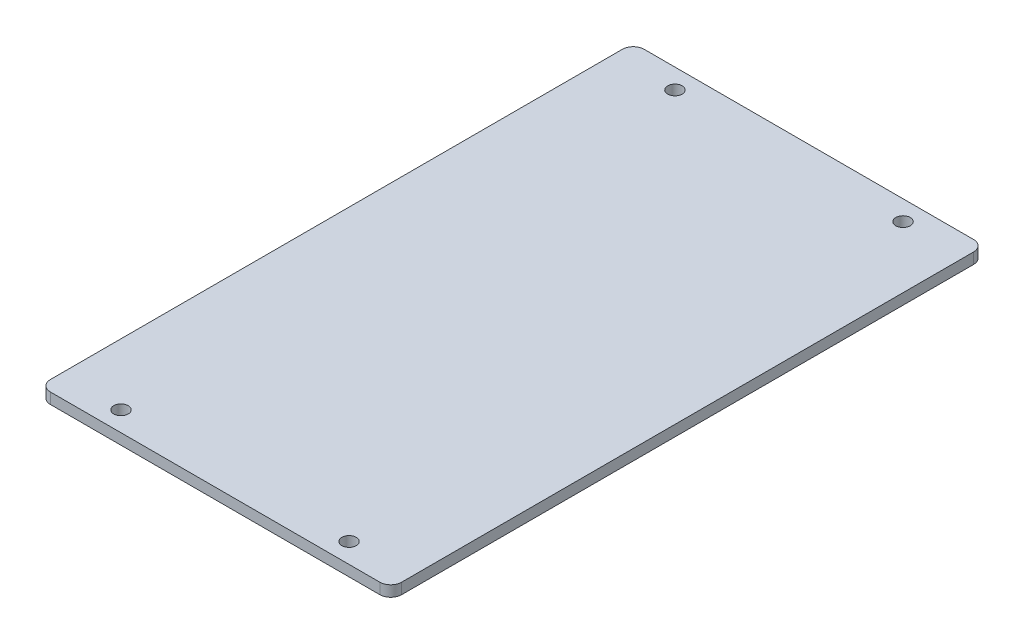
ISO-10303-21;
HEADER;
FILE_DESCRIPTION(('STEP AP214'),'2;1');
FILE_NAME('part.step','',(''),(''),'','','');
FILE_SCHEMA(('AUTOMOTIVE_DESIGN { 1 0 10303 214 1 1 1 1 }'));
ENDSEC;
DATA;
#1=APPLICATION_CONTEXT('core data for automotive mechanical design processes');
#2=APPLICATION_PROTOCOL_DEFINITION('international standard','automotive_design',2000,#1);
#3=PRODUCT_CONTEXT('',#1,'mechanical');
#4=PRODUCT('Part','Part','',(#3));
#5=PRODUCT_RELATED_PRODUCT_CATEGORY('part','',(#4));
#6=PRODUCT_DEFINITION_FORMATION('','',#4);
#7=PRODUCT_DEFINITION_CONTEXT('part definition',#1,'design');
#8=PRODUCT_DEFINITION('design','',#6,#7);
#9=PRODUCT_DEFINITION_SHAPE('','',#8);
#10=(LENGTH_UNIT() NAMED_UNIT(*) SI_UNIT(.MILLI.,.METRE.));
#11=(NAMED_UNIT(*) PLANE_ANGLE_UNIT() SI_UNIT($,.RADIAN.));
#12=(NAMED_UNIT(*) SI_UNIT($,.STERADIAN.) SOLID_ANGLE_UNIT());
#13=UNCERTAINTY_MEASURE_WITH_UNIT(LENGTH_MEASURE(1.E-05),#10,'distance_accuracy_value','');
#14=(GEOMETRIC_REPRESENTATION_CONTEXT(3) GLOBAL_UNCERTAINTY_ASSIGNED_CONTEXT((#13)) GLOBAL_UNIT_ASSIGNED_CONTEXT((#10,
#11,#12)) REPRESENTATION_CONTEXT('',''));
#15=CARTESIAN_POINT('',(0.,0.,0.));
#16=DIRECTION('',(0.,0.,1.));
#17=DIRECTION('',(1.,0.,0.));
#18=AXIS2_PLACEMENT_3D('',#15,#16,#17);
#19=CARTESIAN_POINT('',(-2.,3.,0.));
#20=DIRECTION('',(-1.,0.,0.));
#21=DIRECTION('',(0.,0.,1.));
#22=AXIS2_PLACEMENT_3D('',#19,#20,#21);
#23=PLANE('',#22);
#24=DIRECTION('',(0.,0.,-1.));
#25=VECTOR('',#24,1.);
#26=CARTESIAN_POINT('',(-2.,0.,0.));
#27=LINE('',#26,#25);
#28=CARTESIAN_POINT('',(-2.,0.,-1.));
#29=VERTEX_POINT('',#28);
#30=CARTESIAN_POINT('',(-2.,0.,-159.));
#31=VERTEX_POINT('',#30);
#32=EDGE_CURVE('E112',#29,#31,#27,.T.);
#33=ORIENTED_EDGE('',*,*,#32,.F.);
#34=DIRECTION('',(0.,-1.,0.));
#35=VECTOR('',#34,1.);
#36=CARTESIAN_POINT('',(-2.,3.,-1.));
#37=LINE('',#36,#35);
#38=CARTESIAN_POINT('',(-2.,3.,-1.));
#39=VERTEX_POINT('',#38);
#40=EDGE_CURVE('E11',#29,#39,#37,.F.);
#41=ORIENTED_EDGE('',*,*,#40,.T.);
#42=DIRECTION('',(0.,0.,-1.));
#43=VECTOR('',#42,1.);
#44=CARTESIAN_POINT('',(-2.,3.,0.));
#45=LINE('',#44,#43);
#46=CARTESIAN_POINT('',(-2.,3.,-159.));
#47=VERTEX_POINT('',#46);
#48=EDGE_CURVE('E178',#39,#47,#45,.T.);
#49=ORIENTED_EDGE('',*,*,#48,.T.);
#50=DIRECTION('',(0.,-1.,0.));
#51=VECTOR('',#50,1.);
#52=CARTESIAN_POINT('',(-2.,3.,-159.));
#53=LINE('',#52,#51);
#54=EDGE_CURVE('E49',#47,#31,#53,.T.);
#55=ORIENTED_EDGE('',*,*,#54,.T.);
#56=EDGE_LOOP('',(#33,#41,#49,#55));
#57=FACE_BOUND('',#56,.T.);
#58=ADVANCED_FACE('F40',(#57),#23,.T.);
#59=CARTESIAN_POINT('',(0.,3.,2.));
#60=DIRECTION('',(0.,0.,-1.));
#61=DIRECTION('',(-1.,0.,0.));
#62=AXIS2_PLACEMENT_3D('',#59,#60,#61);
#63=PLANE('',#62);
#64=DIRECTION('',(1.,0.,0.));
#65=VECTOR('',#64,1.);
#66=CARTESIAN_POINT('',(0.,0.,2.));
#67=LINE('',#66,#65);
#68=CARTESIAN_POINT('',(1.,0.,2.));
#69=VERTEX_POINT('',#68);
#70=CARTESIAN_POINT('',(92.,0.,2.));
#71=VERTEX_POINT('',#70);
#72=EDGE_CURVE('E212',#69,#71,#67,.T.);
#73=ORIENTED_EDGE('',*,*,#72,.T.);
#74=DIRECTION('',(0.,-1.,0.));
#75=VECTOR('',#74,1.);
#76=CARTESIAN_POINT('',(92.,3.,2.));
#77=LINE('',#76,#75);
#78=CARTESIAN_POINT('',(92.,3.,2.));
#79=VERTEX_POINT('',#78);
#80=EDGE_CURVE('E56',#71,#79,#77,.F.);
#81=ORIENTED_EDGE('',*,*,#80,.T.);
#82=DIRECTION('',(1.,0.,0.));
#83=VECTOR('',#82,1.);
#84=CARTESIAN_POINT('',(0.,3.,2.));
#85=LINE('',#84,#83);
#86=CARTESIAN_POINT('',(1.,3.,2.));
#87=VERTEX_POINT('',#86);
#88=EDGE_CURVE('E180',#87,#79,#85,.T.);
#89=ORIENTED_EDGE('',*,*,#88,.F.);
#90=DIRECTION('',(0.,-1.,0.));
#91=VECTOR('',#90,1.);
#92=CARTESIAN_POINT('',(1.,0.,2.));
#93=LINE('',#92,#91);
#94=EDGE_CURVE('E169',#87,#69,#93,.T.);
#95=ORIENTED_EDGE('',*,*,#94,.T.);
#96=EDGE_LOOP('',(#73,#81,#89,#95));
#97=FACE_BOUND('',#96,.T.);
#98=ADVANCED_FACE('F230',(#97),#63,.F.);
#99=CARTESIAN_POINT('',(95.,3.,0.));
#100=DIRECTION('',(-1.,0.,0.));
#101=DIRECTION('',(0.,0.,1.));
#102=AXIS2_PLACEMENT_3D('',#99,#100,#101);
#103=PLANE('',#102);
#104=DIRECTION('',(0.,0.,-1.));
#105=VECTOR('',#104,1.);
#106=CARTESIAN_POINT('',(95.,0.,0.));
#107=LINE('',#106,#105);
#108=CARTESIAN_POINT('',(95.,0.,-1.));
#109=VERTEX_POINT('',#108);
#110=CARTESIAN_POINT('',(95.,0.,-159.));
#111=VERTEX_POINT('',#110);
#112=EDGE_CURVE('E130',#109,#111,#107,.T.);
#113=ORIENTED_EDGE('',*,*,#112,.T.);
#114=DIRECTION('',(0.,-1.,0.));
#115=VECTOR('',#114,1.);
#116=CARTESIAN_POINT('',(95.,3.,-159.));
#117=LINE('',#116,#115);
#118=CARTESIAN_POINT('',(95.,3.,-159.));
#119=VERTEX_POINT('',#118);
#120=EDGE_CURVE('E156',#111,#119,#117,.F.);
#121=ORIENTED_EDGE('',*,*,#120,.T.);
#122=DIRECTION('',(0.,0.,-1.));
#123=VECTOR('',#122,1.);
#124=CARTESIAN_POINT('',(95.,3.,0.));
#125=LINE('',#124,#123);
#126=CARTESIAN_POINT('',(95.,3.,-1.));
#127=VERTEX_POINT('',#126);
#128=EDGE_CURVE('E140',#127,#119,#125,.T.);
#129=ORIENTED_EDGE('',*,*,#128,.F.);
#130=DIRECTION('',(0.,-1.,0.));
#131=VECTOR('',#130,1.);
#132=CARTESIAN_POINT('',(95.,3.,-1.));
#133=LINE('',#132,#131);
#134=EDGE_CURVE('E152',#127,#109,#133,.T.);
#135=ORIENTED_EDGE('',*,*,#134,.T.);
#136=EDGE_LOOP('',(#113,#121,#129,#135));
#137=FACE_BOUND('',#136,.T.);
#138=ADVANCED_FACE('F219',(#137),#103,.F.);
#139=CARTESIAN_POINT('',(15.,3.,-3.47847594984671));
#140=DIRECTION('',(0.,-1.,0.));
#141=DIRECTION('',(0.,0.,-1.));
#142=AXIS2_PLACEMENT_3D('',#139,#140,#141);
#143=CYLINDRICAL_SURFACE('',#142,2.);
#144=CARTESIAN_POINT('',(15.,3.,-3.47847594984671));
#145=DIRECTION('',(0.,1.,0.));
#146=DIRECTION('',(0.,0.,1.));
#147=AXIS2_PLACEMENT_3D('',#144,#145,#146);
#148=CIRCLE('',#147,2.);
#149=CARTESIAN_POINT('',(15.,3.,-1.47847594984671));
#150=VERTEX_POINT('',#149);
#151=EDGE_CURVE('E181',#150,#150,#148,.F.);
#152=ORIENTED_EDGE('',*,*,#151,.F.);
#153=EDGE_LOOP('',(#152));
#154=FACE_BOUND('',#153,.T.);
#155=CARTESIAN_POINT('',(15.,0.,-3.47847594984671));
#156=DIRECTION('',(0.,1.,0.));
#157=DIRECTION('',(0.,0.,1.));
#158=AXIS2_PLACEMENT_3D('',#155,#156,#157);
#159=CIRCLE('',#158,2.);
#160=CARTESIAN_POINT('',(15.,0.,-1.47847594984671));
#161=VERTEX_POINT('',#160);
#162=EDGE_CURVE('E206',#161,#161,#159,.F.);
#163=ORIENTED_EDGE('',*,*,#162,.T.);
#164=EDGE_LOOP('',(#163));
#165=FACE_BOUND('',#164,.T.);
#166=ADVANCED_FACE('F248',(#154,#165),#143,.F.);
#167=CARTESIAN_POINT('',(78.,3.,-3.47847594984671));
#168=DIRECTION('',(0.,-1.,0.));
#169=DIRECTION('',(0.,0.,-1.));
#170=AXIS2_PLACEMENT_3D('',#167,#168,#169);
#171=CYLINDRICAL_SURFACE('',#170,2.);
#172=CARTESIAN_POINT('',(78.,3.,-3.47847594984671));
#173=DIRECTION('',(0.,1.,0.));
#174=DIRECTION('',(0.,0.,1.));
#175=AXIS2_PLACEMENT_3D('',#172,#173,#174);
#176=CIRCLE('',#175,2.);
#177=CARTESIAN_POINT('',(78.,3.,-1.47847594984671));
#178=VERTEX_POINT('',#177);
#179=EDGE_CURVE('E187',#178,#178,#176,.T.);
#180=ORIENTED_EDGE('',*,*,#179,.T.);
#181=EDGE_LOOP('',(#180));
#182=FACE_BOUND('',#181,.T.);
#183=CARTESIAN_POINT('',(78.,0.,-3.47847594984671));
#184=DIRECTION('',(0.,1.,0.));
#185=DIRECTION('',(0.,0.,1.));
#186=AXIS2_PLACEMENT_3D('',#183,#184,#185);
#187=CIRCLE('',#186,2.);
#188=CARTESIAN_POINT('',(78.,0.,-1.47847594984671));
#189=VERTEX_POINT('',#188);
#190=EDGE_CURVE('E202',#189,#189,#187,.T.);
#191=ORIENTED_EDGE('',*,*,#190,.F.);
#192=EDGE_LOOP('',(#191));
#193=FACE_BOUND('',#192,.T.);
#194=ADVANCED_FACE('F251',(#182,#193),#171,.F.);
#195=CARTESIAN_POINT('',(15.,3.,-156.521524050153));
#196=DIRECTION('',(0.,-1.,0.));
#197=DIRECTION('',(0.,0.,-1.));
#198=AXIS2_PLACEMENT_3D('',#195,#196,#197);
#199=CYLINDRICAL_SURFACE('',#198,2.);
#200=CARTESIAN_POINT('',(15.,3.,-156.521524050153));
#201=DIRECTION('',(0.,1.,0.));
#202=DIRECTION('',(0.,0.,1.));
#203=AXIS2_PLACEMENT_3D('',#200,#201,#202);
#204=CIRCLE('',#203,2.);
#205=CARTESIAN_POINT('',(15.,3.,-154.521524050153));
#206=VERTEX_POINT('',#205);
#207=EDGE_CURVE('E425',#206,#206,#204,.T.);
#208=ORIENTED_EDGE('',*,*,#207,.T.);
#209=EDGE_LOOP('',(#208));
#210=FACE_BOUND('',#209,.T.);
#211=CARTESIAN_POINT('',(15.,0.,-156.521524050153));
#212=DIRECTION('',(0.,1.,0.));
#213=DIRECTION('',(0.,0.,1.));
#214=AXIS2_PLACEMENT_3D('',#211,#212,#213);
#215=CIRCLE('',#214,2.);
#216=CARTESIAN_POINT('',(15.,0.,-154.521524050153));
#217=VERTEX_POINT('',#216);
#218=EDGE_CURVE('E198',#217,#217,#215,.T.);
#219=ORIENTED_EDGE('',*,*,#218,.F.);
#220=EDGE_LOOP('',(#219));
#221=FACE_BOUND('',#220,.T.);
#222=ADVANCED_FACE('F255',(#210,#221),#199,.F.);
#223=CARTESIAN_POINT('',(78.,3.,-156.521524050153));
#224=DIRECTION('',(0.,-1.,0.));
#225=DIRECTION('',(0.,0.,-1.));
#226=AXIS2_PLACEMENT_3D('',#223,#224,#225);
#227=CYLINDRICAL_SURFACE('',#226,2.);
#228=CARTESIAN_POINT('',(78.,3.,-156.521524050153));
#229=DIRECTION('',(0.,1.,0.));
#230=DIRECTION('',(0.,0.,1.));
#231=AXIS2_PLACEMENT_3D('',#228,#229,#230);
#232=CIRCLE('',#231,2.);
#233=CARTESIAN_POINT('',(78.,3.,-154.521524050153));
#234=VERTEX_POINT('',#233);
#235=EDGE_CURVE('E129',#234,#234,#232,.F.);
#236=ORIENTED_EDGE('',*,*,#235,.F.);
#237=EDGE_LOOP('',(#236));
#238=FACE_BOUND('',#237,.T.);
#239=CARTESIAN_POINT('',(78.,0.,-156.521524050153));
#240=DIRECTION('',(0.,1.,0.));
#241=DIRECTION('',(0.,0.,1.));
#242=AXIS2_PLACEMENT_3D('',#239,#240,#241);
#243=CIRCLE('',#242,2.);
#244=CARTESIAN_POINT('',(78.,0.,-154.521524050153));
#245=VERTEX_POINT('',#244);
#246=EDGE_CURVE('E194',#245,#245,#243,.F.);
#247=ORIENTED_EDGE('',*,*,#246,.T.);
#248=EDGE_LOOP('',(#247));
#249=FACE_BOUND('',#248,.T.);
#250=ADVANCED_FACE('F259',(#238,#249),#227,.F.);
#251=CARTESIAN_POINT('',(0.,3.,-162.));
#252=DIRECTION('',(0.,0.,-1.));
#253=DIRECTION('',(-1.,0.,0.));
#254=AXIS2_PLACEMENT_3D('',#251,#252,#253);
#255=PLANE('',#254);
#256=DIRECTION('',(1.,0.,0.));
#257=VECTOR('',#256,1.);
#258=CARTESIAN_POINT('',(0.,3.,-162.));
#259=LINE('',#258,#257);
#260=CARTESIAN_POINT('',(1.,3.,-162.));
#261=VERTEX_POINT('',#260);
#262=CARTESIAN_POINT('',(92.,3.,-162.));
#263=VERTEX_POINT('',#262);
#264=EDGE_CURVE('E135',#261,#263,#259,.T.);
#265=ORIENTED_EDGE('',*,*,#264,.T.);
#266=DIRECTION('',(0.,-1.,0.));
#267=VECTOR('',#266,1.);
#268=CARTESIAN_POINT('',(92.,0.,-162.));
#269=LINE('',#268,#267);
#270=CARTESIAN_POINT('',(92.,0.,-162.));
#271=VERTEX_POINT('',#270);
#272=EDGE_CURVE('E119',#263,#271,#269,.T.);
#273=ORIENTED_EDGE('',*,*,#272,.T.);
#274=DIRECTION('',(1.,0.,0.));
#275=VECTOR('',#274,1.);
#276=CARTESIAN_POINT('',(0.,0.,-162.));
#277=LINE('',#276,#275);
#278=CARTESIAN_POINT('',(1.,0.,-162.));
#279=VERTEX_POINT('',#278);
#280=EDGE_CURVE('E110',#279,#271,#277,.T.);
#281=ORIENTED_EDGE('',*,*,#280,.F.);
#282=DIRECTION('',(0.,-1.,0.));
#283=VECTOR('',#282,1.);
#284=CARTESIAN_POINT('',(1.,3.,-162.));
#285=LINE('',#284,#283);
#286=EDGE_CURVE('E125',#279,#261,#285,.F.);
#287=ORIENTED_EDGE('',*,*,#286,.T.);
#288=EDGE_LOOP('',(#265,#273,#281,#287));
#289=FACE_BOUND('',#288,.T.);
#290=ADVANCED_FACE('F124',(#289),#255,.T.);
#291=CARTESIAN_POINT('',(0.,3.,0.));
#292=DIRECTION('',(0.,1.,0.));
#293=DIRECTION('',(0.,0.,1.));
#294=AXIS2_PLACEMENT_3D('',#291,#292,#293);
#295=PLANE('',#294);
#296=ORIENTED_EDGE('',*,*,#235,.T.);
#297=EDGE_LOOP('',(#296));
#298=FACE_BOUND('',#297,.T.);
#299=ORIENTED_EDGE('',*,*,#207,.F.);
#300=EDGE_LOOP('',(#299));
#301=FACE_BOUND('',#300,.T.);
#302=ORIENTED_EDGE('',*,*,#179,.F.);
#303=EDGE_LOOP('',(#302));
#304=FACE_BOUND('',#303,.T.);
#305=ORIENTED_EDGE('',*,*,#151,.T.);
#306=EDGE_LOOP('',(#305));
#307=FACE_BOUND('',#306,.T.);
#308=ORIENTED_EDGE('',*,*,#128,.T.);
#309=CARTESIAN_POINT('',(92.,3.,-159.));
#310=DIRECTION('',(0.,1.,0.));
#311=DIRECTION('',(0.,0.,1.));
#312=AXIS2_PLACEMENT_3D('',#309,#310,#311);
#313=CIRCLE('',#312,3.);
#314=EDGE_CURVE('E166',#119,#263,#313,.T.);
#315=ORIENTED_EDGE('',*,*,#314,.T.);
#316=ORIENTED_EDGE('',*,*,#264,.F.);
#317=CARTESIAN_POINT('',(1.,3.,-159.));
#318=DIRECTION('',(0.,1.,0.));
#319=DIRECTION('',(0.,0.,1.));
#320=AXIS2_PLACEMENT_3D('',#317,#318,#319);
#321=CIRCLE('',#320,3.);
#322=EDGE_CURVE('E133',#261,#47,#321,.T.);
#323=ORIENTED_EDGE('',*,*,#322,.T.);
#324=ORIENTED_EDGE('',*,*,#48,.F.);
#325=CARTESIAN_POINT('',(1.,3.,-1.));
#326=DIRECTION('',(0.,1.,0.));
#327=DIRECTION('',(0.,0.,1.));
#328=AXIS2_PLACEMENT_3D('',#325,#326,#327);
#329=CIRCLE('',#328,3.);
#330=EDGE_CURVE('E63',#39,#87,#329,.T.);
#331=ORIENTED_EDGE('',*,*,#330,.T.);
#332=ORIENTED_EDGE('',*,*,#88,.T.);
#333=CARTESIAN_POINT('',(92.,3.,-1.));
#334=DIRECTION('',(0.,1.,0.));
#335=DIRECTION('',(0.,0.,1.));
#336=AXIS2_PLACEMENT_3D('',#333,#334,#335);
#337=CIRCLE('',#336,3.);
#338=EDGE_CURVE('E163',#79,#127,#337,.T.);
#339=ORIENTED_EDGE('',*,*,#338,.T.);
#340=EDGE_LOOP('',(#308,#315,#316,#323,#324,#331,#332,#339));
#341=FACE_BOUND('',#340,.T.);
#342=ADVANCED_FACE('F225',(#298,#301,#304,#307,#341),#295,.T.);
#343=CARTESIAN_POINT('',(0.,0.,0.));
#344=DIRECTION('',(0.,1.,0.));
#345=DIRECTION('',(0.,0.,1.));
#346=AXIS2_PLACEMENT_3D('',#343,#344,#345);
#347=PLANE('',#346);
#348=ORIENTED_EDGE('',*,*,#246,.F.);
#349=EDGE_LOOP('',(#348));
#350=FACE_BOUND('',#349,.T.);
#351=ORIENTED_EDGE('',*,*,#218,.T.);
#352=EDGE_LOOP('',(#351));
#353=FACE_BOUND('',#352,.T.);
#354=ORIENTED_EDGE('',*,*,#190,.T.);
#355=EDGE_LOOP('',(#354));
#356=FACE_BOUND('',#355,.T.);
#357=ORIENTED_EDGE('',*,*,#162,.F.);
#358=EDGE_LOOP('',(#357));
#359=FACE_BOUND('',#358,.T.);
#360=ORIENTED_EDGE('',*,*,#280,.T.);
#361=CARTESIAN_POINT('',(92.,0.,-159.));
#362=DIRECTION('',(0.,1.,0.));
#363=DIRECTION('',(0.,0.,1.));
#364=AXIS2_PLACEMENT_3D('',#361,#362,#363);
#365=CIRCLE('',#364,3.);
#366=EDGE_CURVE('E149',#271,#111,#365,.F.);
#367=ORIENTED_EDGE('',*,*,#366,.T.);
#368=ORIENTED_EDGE('',*,*,#112,.F.);
#369=CARTESIAN_POINT('',(92.,0.,-1.));
#370=DIRECTION('',(0.,1.,0.));
#371=DIRECTION('',(0.,0.,1.));
#372=AXIS2_PLACEMENT_3D('',#369,#370,#371);
#373=CIRCLE('',#372,3.);
#374=EDGE_CURVE('E146',#109,#71,#373,.F.);
#375=ORIENTED_EDGE('',*,*,#374,.T.);
#376=ORIENTED_EDGE('',*,*,#72,.F.);
#377=CARTESIAN_POINT('',(1.,0.,-1.));
#378=DIRECTION('',(0.,1.,0.));
#379=DIRECTION('',(0.,0.,1.));
#380=AXIS2_PLACEMENT_3D('',#377,#378,#379);
#381=CIRCLE('',#380,3.);
#382=EDGE_CURVE('E118',#69,#29,#381,.F.);
#383=ORIENTED_EDGE('',*,*,#382,.T.);
#384=ORIENTED_EDGE('',*,*,#32,.T.);
#385=CARTESIAN_POINT('',(1.,0.,-159.));
#386=DIRECTION('',(0.,1.,0.));
#387=DIRECTION('',(0.,0.,1.));
#388=AXIS2_PLACEMENT_3D('',#385,#386,#387);
#389=CIRCLE('',#388,3.);
#390=EDGE_CURVE('E107',#31,#279,#389,.F.);
#391=ORIENTED_EDGE('',*,*,#390,.T.);
#392=EDGE_LOOP('',(#360,#367,#368,#375,#376,#383,#384,#391));
#393=FACE_BOUND('',#392,.T.);
#394=ADVANCED_FACE('F109',(#350,#353,#356,#359,#393),#347,.F.);
#395=CARTESIAN_POINT('',(92.,3.,-159.));
#396=DIRECTION('',(0.,1.,0.));
#397=DIRECTION('',(0.,0.,1.));
#398=AXIS2_PLACEMENT_3D('',#395,#396,#397);
#399=CYLINDRICAL_SURFACE('',#398,3.);
#400=ORIENTED_EDGE('',*,*,#314,.F.);
#401=ORIENTED_EDGE('',*,*,#120,.F.);
#402=ORIENTED_EDGE('',*,*,#366,.F.);
#403=ORIENTED_EDGE('',*,*,#272,.F.);
#404=EDGE_LOOP('',(#400,#401,#402,#403));
#405=FACE_BOUND('',#404,.T.);
#406=ADVANCED_FACE('F224',(#405),#399,.T.);
#407=CARTESIAN_POINT('',(92.,3.,-1.));
#408=DIRECTION('',(0.,-1.,0.));
#409=DIRECTION('',(0.,0.,-1.));
#410=AXIS2_PLACEMENT_3D('',#407,#408,#409);
#411=CYLINDRICAL_SURFACE('',#410,3.);
#412=ORIENTED_EDGE('',*,*,#338,.F.);
#413=ORIENTED_EDGE('',*,*,#80,.F.);
#414=ORIENTED_EDGE('',*,*,#374,.F.);
#415=ORIENTED_EDGE('',*,*,#134,.F.);
#416=EDGE_LOOP('',(#412,#413,#414,#415));
#417=FACE_BOUND('',#416,.T.);
#418=ADVANCED_FACE('F228',(#417),#411,.T.);
#419=CARTESIAN_POINT('',(1.,3.,-1.));
#420=DIRECTION('',(0.,1.,0.));
#421=DIRECTION('',(0.,0.,1.));
#422=AXIS2_PLACEMENT_3D('',#419,#420,#421);
#423=CYLINDRICAL_SURFACE('',#422,3.);
#424=ORIENTED_EDGE('',*,*,#330,.F.);
#425=ORIENTED_EDGE('',*,*,#40,.F.);
#426=ORIENTED_EDGE('',*,*,#382,.F.);
#427=ORIENTED_EDGE('',*,*,#94,.F.);
#428=EDGE_LOOP('',(#424,#425,#426,#427));
#429=FACE_BOUND('',#428,.T.);
#430=ADVANCED_FACE('F233',(#429),#423,.T.);
#431=CARTESIAN_POINT('',(1.,3.,-159.));
#432=DIRECTION('',(0.,-1.,0.));
#433=DIRECTION('',(0.,0.,-1.));
#434=AXIS2_PLACEMENT_3D('',#431,#432,#433);
#435=CYLINDRICAL_SURFACE('',#434,3.);
#436=ORIENTED_EDGE('',*,*,#322,.F.);
#437=ORIENTED_EDGE('',*,*,#286,.F.);
#438=ORIENTED_EDGE('',*,*,#390,.F.);
#439=ORIENTED_EDGE('',*,*,#54,.F.);
#440=EDGE_LOOP('',(#436,#437,#438,#439));
#441=FACE_BOUND('',#440,.T.);
#442=ADVANCED_FACE('F42',(#441),#435,.T.);
#443=CLOSED_SHELL('',(#58,#98,#138,#166,#194,#222,#250,#290,#342,#394,#406,#418,#430,#442));
#444=MANIFOLD_SOLID_BREP('B2',#443);
#445=ADVANCED_BREP_SHAPE_REPRESENTATION('',(#18,#444),#14);
#446=SHAPE_DEFINITION_REPRESENTATION(#9,#445);
ENDSEC;
END-ISO-10303-21;
